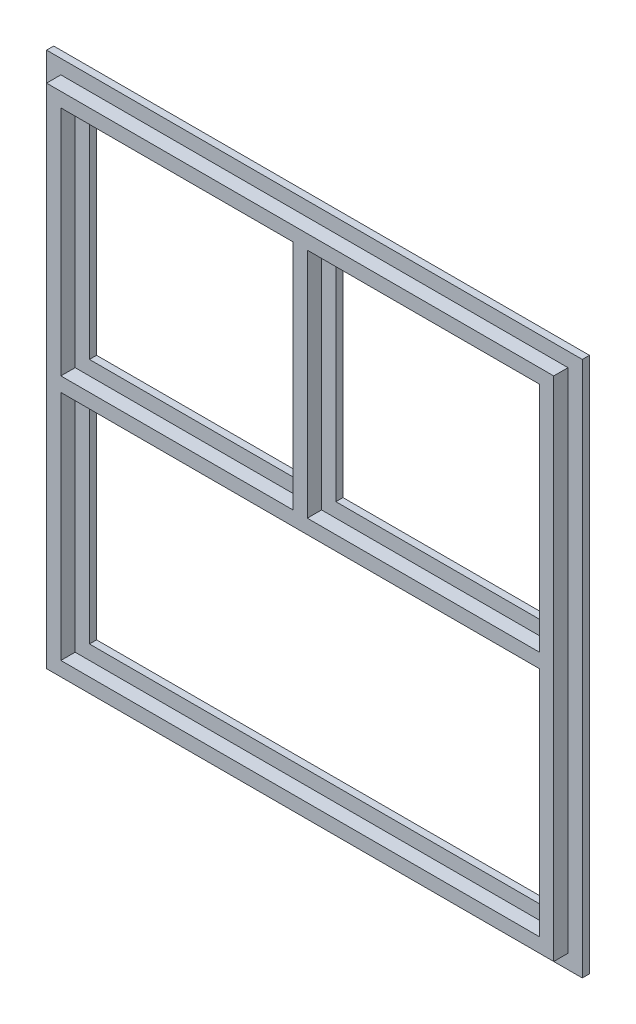
ISO-10303-21;
HEADER;
FILE_DESCRIPTION(('STEP AP214'),'2;1');
FILE_NAME('part.step','',(''),(''),'','','');
FILE_SCHEMA(('AUTOMOTIVE_DESIGN { 1 0 10303 214 1 1 1 1 }'));
ENDSEC;
DATA;
#1=APPLICATION_CONTEXT('core data for automotive mechanical design processes');
#2=APPLICATION_PROTOCOL_DEFINITION('international standard','automotive_design',2000,#1);
#3=PRODUCT_CONTEXT('',#1,'mechanical');
#4=PRODUCT('Part','Part','',(#3));
#5=PRODUCT_RELATED_PRODUCT_CATEGORY('part','',(#4));
#6=PRODUCT_DEFINITION_FORMATION('','',#4);
#7=PRODUCT_DEFINITION_CONTEXT('part definition',#1,'design');
#8=PRODUCT_DEFINITION('design','',#6,#7);
#9=PRODUCT_DEFINITION_SHAPE('','',#8);
#10=(LENGTH_UNIT() NAMED_UNIT(*) SI_UNIT(.MILLI.,.METRE.));
#11=(NAMED_UNIT(*) PLANE_ANGLE_UNIT() SI_UNIT($,.RADIAN.));
#12=(NAMED_UNIT(*) SI_UNIT($,.STERADIAN.) SOLID_ANGLE_UNIT());
#13=UNCERTAINTY_MEASURE_WITH_UNIT(LENGTH_MEASURE(1.E-05),#10,'distance_accuracy_value','');
#14=(GEOMETRIC_REPRESENTATION_CONTEXT(3) GLOBAL_UNCERTAINTY_ASSIGNED_CONTEXT((#13)) GLOBAL_UNIT_ASSIGNED_CONTEXT((#10,
#11,#12)) REPRESENTATION_CONTEXT('',''));
#15=CARTESIAN_POINT('',(0.,0.,0.));
#16=DIRECTION('',(0.,0.,1.));
#17=DIRECTION('',(1.,0.,0.));
#18=AXIS2_PLACEMENT_3D('',#15,#16,#17);
#19=CARTESIAN_POINT('',(0.,0.,1.));
#20=DIRECTION('',(0.,0.,-1.));
#21=DIRECTION('',(-1.,0.,0.));
#22=AXIS2_PLACEMENT_3D('',#19,#20,#21);
#23=PLANE('',#22);
#24=DIRECTION('',(0.,-1.,0.));
#25=VECTOR('',#24,1.);
#26=CARTESIAN_POINT('',(31.5,0.,1.));
#27=LINE('',#26,#25);
#28=CARTESIAN_POINT('',(31.5,-2.99999999999998,1.));
#29=VERTEX_POINT('',#28);
#30=CARTESIAN_POINT('',(31.5,-31.5,1.));
#31=VERTEX_POINT('',#30);
#32=EDGE_CURVE('E339',#29,#31,#27,.T.);
#33=ORIENTED_EDGE('',*,*,#32,.T.);
#34=DIRECTION('',(1.,0.,0.));
#35=VECTOR('',#34,1.);
#36=CARTESIAN_POINT('',(0.,-31.5,1.));
#37=LINE('',#36,#35);
#38=CARTESIAN_POINT('',(-31.5,-31.5,1.));
#39=VERTEX_POINT('',#38);
#40=EDGE_CURVE('E352',#39,#31,#37,.T.);
#41=ORIENTED_EDGE('',*,*,#40,.F.);
#42=DIRECTION('',(0.,-1.,0.));
#43=VECTOR('',#42,1.);
#44=CARTESIAN_POINT('',(-31.5,0.,1.));
#45=LINE('',#44,#43);
#46=CARTESIAN_POINT('',(-31.5,-2.99999999999999,1.));
#47=VERTEX_POINT('',#46);
#48=EDGE_CURVE('E348',#47,#39,#45,.T.);
#49=ORIENTED_EDGE('',*,*,#48,.F.);
#50=DIRECTION('',(1.,0.,0.));
#51=VECTOR('',#50,1.);
#52=CARTESIAN_POINT('',(0.,-2.99999999999998,1.));
#53=LINE('',#52,#51);
#54=EDGE_CURVE('E343',#47,#29,#53,.T.);
#55=ORIENTED_EDGE('',*,*,#54,.T.);
#56=EDGE_LOOP('',(#33,#41,#49,#55));
#57=FACE_BOUND('',#56,.T.);
#58=DIRECTION('',(1.,0.,0.));
#59=VECTOR('',#58,1.);
#60=CARTESIAN_POINT('',(0.,-1.,1.));
#61=LINE('',#60,#59);
#62=CARTESIAN_POINT('',(-33.5,-1.,1.));
#63=VERTEX_POINT('',#62);
#64=CARTESIAN_POINT('',(33.5,-1.,1.));
#65=VERTEX_POINT('',#64);
#66=EDGE_CURVE('E306',#63,#65,#61,.T.);
#67=ORIENTED_EDGE('',*,*,#66,.F.);
#68=DIRECTION('',(0.,-1.,0.));
#69=VECTOR('',#68,1.);
#70=CARTESIAN_POINT('',(-33.5,-33.5,1.));
#71=LINE('',#70,#69);
#72=CARTESIAN_POINT('',(-33.5,-33.5,1.));
#73=VERTEX_POINT('',#72);
#74=EDGE_CURVE('E277',#63,#73,#71,.T.);
#75=ORIENTED_EDGE('',*,*,#74,.T.);
#76=DIRECTION('',(1.,0.,0.));
#77=VECTOR('',#76,1.);
#78=CARTESIAN_POINT('',(-33.5,-33.5,1.));
#79=LINE('',#78,#77);
#80=CARTESIAN_POINT('',(33.5,-33.5,1.));
#81=VERTEX_POINT('',#80);
#82=EDGE_CURVE('E478',#73,#81,#79,.T.);
#83=ORIENTED_EDGE('',*,*,#82,.T.);
#84=DIRECTION('',(0.,1.,0.));
#85=VECTOR('',#84,1.);
#86=CARTESIAN_POINT('',(33.5,-33.5,1.));
#87=LINE('',#86,#85);
#88=EDGE_CURVE('E467',#81,#65,#87,.T.);
#89=ORIENTED_EDGE('',*,*,#88,.T.);
#90=EDGE_LOOP('',(#67,#75,#83,#89));
#91=FACE_BOUND('',#90,.T.);
#92=ADVANCED_FACE('F47',(#57,#91),#23,.F.);
#93=DIRECTION('',(1.,0.,0.));
#94=VECTOR('',#93,1.);
#95=CARTESIAN_POINT('',(2.99999999999999,31.5,1.));
#96=LINE('',#95,#94);
#97=CARTESIAN_POINT('',(2.99999999999999,31.5,1.));
#98=VERTEX_POINT('',#97);
#99=CARTESIAN_POINT('',(31.5,31.5,1.));
#100=VERTEX_POINT('',#99);
#101=EDGE_CURVE('E384',#98,#100,#96,.T.);
#102=ORIENTED_EDGE('',*,*,#101,.T.);
#103=DIRECTION('',(0.,1.,0.));
#104=VECTOR('',#103,1.);
#105=CARTESIAN_POINT('',(31.5,3.00000000000001,1.));
#106=LINE('',#105,#104);
#107=CARTESIAN_POINT('',(31.5,3.00000000000001,1.));
#108=VERTEX_POINT('',#107);
#109=EDGE_CURVE('E419',#108,#100,#106,.T.);
#110=ORIENTED_EDGE('',*,*,#109,.F.);
#111=DIRECTION('',(1.,0.,0.));
#112=VECTOR('',#111,1.);
#113=CARTESIAN_POINT('',(2.99999999999999,3.00000000000001,1.));
#114=LINE('',#113,#112);
#115=CARTESIAN_POINT('',(2.99999999999999,3.00000000000001,1.));
#116=VERTEX_POINT('',#115);
#117=EDGE_CURVE('E415',#116,#108,#114,.T.);
#118=ORIENTED_EDGE('',*,*,#117,.F.);
#119=DIRECTION('',(0.,1.,0.));
#120=VECTOR('',#119,1.);
#121=CARTESIAN_POINT('',(2.99999999999999,3.00000000000001,1.));
#122=LINE('',#121,#120);
#123=EDGE_CURVE('E411',#116,#98,#122,.T.);
#124=ORIENTED_EDGE('',*,*,#123,.T.);
#125=EDGE_LOOP('',(#102,#110,#118,#124));
#126=FACE_BOUND('',#125,.T.);
#127=DIRECTION('',(-1.,0.,0.));
#128=VECTOR('',#127,1.);
#129=CARTESIAN_POINT('',(0.,1.00000000000001,1.));
#130=LINE('',#129,#128);
#131=CARTESIAN_POINT('',(33.5,1.00000000000001,1.));
#132=VERTEX_POINT('',#131);
#133=CARTESIAN_POINT('',(1.,1.00000000000001,1.));
#134=VERTEX_POINT('',#133);
#135=EDGE_CURVE('E309',#132,#134,#130,.T.);
#136=ORIENTED_EDGE('',*,*,#135,.F.);
#137=CARTESIAN_POINT('',(33.5,33.5,1.));
#138=VERTEX_POINT('',#137);
#139=EDGE_CURVE('E455',#132,#138,#87,.T.);
#140=ORIENTED_EDGE('',*,*,#139,.T.);
#141=DIRECTION('',(-1.,0.,0.));
#142=VECTOR('',#141,1.);
#143=CARTESIAN_POINT('',(-33.5,33.5,1.));
#144=LINE('',#143,#142);
#145=CARTESIAN_POINT('',(1.,33.5,1.));
#146=VERTEX_POINT('',#145);
#147=EDGE_CURVE('E472',#138,#146,#144,.T.);
#148=ORIENTED_EDGE('',*,*,#147,.T.);
#149=DIRECTION('',(0.,1.,0.));
#150=VECTOR('',#149,1.);
#151=CARTESIAN_POINT('',(1.,0.,1.));
#152=LINE('',#151,#150);
#153=EDGE_CURVE('E63',#134,#146,#152,.T.);
#154=ORIENTED_EDGE('',*,*,#153,.F.);
#155=EDGE_LOOP('',(#136,#140,#148,#154));
#156=FACE_BOUND('',#155,.T.);
#157=ADVANCED_FACE('F614',(#126,#156),#23,.F.);
#158=DIRECTION('',(-1.,0.,0.));
#159=VECTOR('',#158,1.);
#160=CARTESIAN_POINT('',(-3.00000000000001,31.5,1.));
#161=LINE('',#160,#159);
#162=CARTESIAN_POINT('',(-3.00000000000001,31.5,1.));
#163=VERTEX_POINT('',#162);
#164=CARTESIAN_POINT('',(-31.5,31.5,1.));
#165=VERTEX_POINT('',#164);
#166=EDGE_CURVE('E344',#163,#165,#161,.T.);
#167=ORIENTED_EDGE('',*,*,#166,.F.);
#168=DIRECTION('',(0.,1.,0.));
#169=VECTOR('',#168,1.);
#170=CARTESIAN_POINT('',(-3.00000000000002,3.00000000000001,1.));
#171=LINE('',#170,#169);
#172=CARTESIAN_POINT('',(-3.00000000000002,3.00000000000001,1.));
#173=VERTEX_POINT('',#172);
#174=EDGE_CURVE('E373',#173,#163,#171,.T.);
#175=ORIENTED_EDGE('',*,*,#174,.F.);
#176=DIRECTION('',(-1.,0.,0.));
#177=VECTOR('',#176,1.);
#178=CARTESIAN_POINT('',(-3.00000000000002,3.00000000000001,1.));
#179=LINE('',#178,#177);
#180=CARTESIAN_POINT('',(-31.5,3.00000000000001,1.));
#181=VERTEX_POINT('',#180);
#182=EDGE_CURVE('E388',#173,#181,#179,.T.);
#183=ORIENTED_EDGE('',*,*,#182,.T.);
#184=DIRECTION('',(0.,1.,0.));
#185=VECTOR('',#184,1.);
#186=CARTESIAN_POINT('',(-31.5,3.00000000000001,1.));
#187=LINE('',#186,#185);
#188=EDGE_CURVE('E392',#181,#165,#187,.T.);
#189=ORIENTED_EDGE('',*,*,#188,.T.);
#190=EDGE_LOOP('',(#167,#175,#183,#189));
#191=FACE_BOUND('',#190,.T.);
#192=DIRECTION('',(0.,-1.,0.));
#193=VECTOR('',#192,1.);
#194=CARTESIAN_POINT('',(-1.,0.,1.));
#195=LINE('',#194,#193);
#196=CARTESIAN_POINT('',(-1.,33.5,1.));
#197=VERTEX_POINT('',#196);
#198=CARTESIAN_POINT('',(-1.,1.00000000000001,1.));
#199=VERTEX_POINT('',#198);
#200=EDGE_CURVE('E292',#197,#199,#195,.T.);
#201=ORIENTED_EDGE('',*,*,#200,.F.);
#202=CARTESIAN_POINT('',(-33.5,33.5,1.));
#203=VERTEX_POINT('',#202);
#204=EDGE_CURVE('E471',#197,#203,#144,.T.);
#205=ORIENTED_EDGE('',*,*,#204,.T.);
#206=CARTESIAN_POINT('',(-33.5,1.,1.));
#207=VERTEX_POINT('',#206);
#208=EDGE_CURVE('E475',#203,#207,#71,.T.);
#209=ORIENTED_EDGE('',*,*,#208,.T.);
#210=DIRECTION('',(-1.,0.,0.));
#211=VECTOR('',#210,1.);
#212=CARTESIAN_POINT('',(0.,1.00000000000001,1.));
#213=LINE('',#212,#211);
#214=EDGE_CURVE('E71',#199,#207,#213,.T.);
#215=ORIENTED_EDGE('',*,*,#214,.F.);
#216=EDGE_LOOP('',(#201,#205,#209,#215));
#217=FACE_BOUND('',#216,.T.);
#218=ADVANCED_FACE('F611',(#191,#217),#23,.F.);
#219=CARTESIAN_POINT('',(33.5,-33.5,3.));
#220=DIRECTION('',(-1.,0.,0.));
#221=DIRECTION('',(0.,0.,1.));
#222=AXIS2_PLACEMENT_3D('',#219,#220,#221);
#223=PLANE('',#222);
#224=DIRECTION('',(0.,1.,0.));
#225=VECTOR('',#224,1.);
#226=CARTESIAN_POINT('',(33.5,-33.5,3.));
#227=LINE('',#226,#225);
#228=CARTESIAN_POINT('',(33.5,-33.5,3.));
#229=VERTEX_POINT('',#228);
#230=CARTESIAN_POINT('',(33.5,-1.,3.));
#231=VERTEX_POINT('',#230);
#232=EDGE_CURVE('E456',#229,#231,#227,.T.);
#233=ORIENTED_EDGE('',*,*,#232,.T.);
#234=DIRECTION('',(0.,0.,-1.));
#235=VECTOR('',#234,1.);
#236=CARTESIAN_POINT('',(33.5,-1.,3.));
#237=LINE('',#236,#235);
#238=EDGE_CURVE('E282',#231,#65,#237,.T.);
#239=ORIENTED_EDGE('',*,*,#238,.T.);
#240=ORIENTED_EDGE('',*,*,#88,.F.);
#241=DIRECTION('',(0.,0.,-1.));
#242=VECTOR('',#241,1.);
#243=CARTESIAN_POINT('',(33.5,-33.5,3.));
#244=LINE('',#243,#242);
#245=EDGE_CURVE('E466',#229,#81,#244,.T.);
#246=ORIENTED_EDGE('',*,*,#245,.F.);
#247=EDGE_LOOP('',(#233,#239,#240,#246));
#248=FACE_BOUND('',#247,.T.);
#249=ADVANCED_FACE('F613',(#248),#223,.T.);
#250=ORIENTED_EDGE('',*,*,#139,.F.);
#251=DIRECTION('',(0.,0.,-1.));
#252=VECTOR('',#251,1.);
#253=CARTESIAN_POINT('',(33.5,1.00000000000001,3.));
#254=LINE('',#253,#252);
#255=CARTESIAN_POINT('',(33.5,1.00000000000001,3.));
#256=VERTEX_POINT('',#255);
#257=EDGE_CURVE('E333',#256,#132,#254,.T.);
#258=ORIENTED_EDGE('',*,*,#257,.F.);
#259=CARTESIAN_POINT('',(33.5,33.5,3.));
#260=VERTEX_POINT('',#259);
#261=EDGE_CURVE('E460',#256,#260,#227,.T.);
#262=ORIENTED_EDGE('',*,*,#261,.T.);
#263=DIRECTION('',(0.,0.,-1.));
#264=VECTOR('',#263,1.);
#265=CARTESIAN_POINT('',(33.5,33.5,3.));
#266=LINE('',#265,#264);
#267=EDGE_CURVE('E491',#260,#138,#266,.T.);
#268=ORIENTED_EDGE('',*,*,#267,.T.);
#269=EDGE_LOOP('',(#250,#258,#262,#268));
#270=FACE_BOUND('',#269,.T.);
#271=ADVANCED_FACE('F645',(#270),#223,.T.);
#272=CARTESIAN_POINT('',(-33.5,33.5,3.));
#273=DIRECTION('',(0.,-1.,0.));
#274=DIRECTION('',(0.,0.,-1.));
#275=AXIS2_PLACEMENT_3D('',#272,#273,#274);
#276=PLANE('',#275);
#277=DIRECTION('',(-1.,0.,0.));
#278=VECTOR('',#277,1.);
#279=CARTESIAN_POINT('',(-33.5,33.5,3.));
#280=LINE('',#279,#278);
#281=CARTESIAN_POINT('',(1.,33.5,3.));
#282=VERTEX_POINT('',#281);
#283=EDGE_CURVE('E271',#260,#282,#280,.T.);
#284=ORIENTED_EDGE('',*,*,#283,.T.);
#285=DIRECTION('',(0.,0.,-1.));
#286=VECTOR('',#285,1.);
#287=CARTESIAN_POINT('',(1.,33.5,3.));
#288=LINE('',#287,#286);
#289=EDGE_CURVE('E326',#282,#146,#288,.T.);
#290=ORIENTED_EDGE('',*,*,#289,.T.);
#291=ORIENTED_EDGE('',*,*,#147,.F.);
#292=ORIENTED_EDGE('',*,*,#267,.F.);
#293=EDGE_LOOP('',(#284,#290,#291,#292));
#294=FACE_BOUND('',#293,.T.);
#295=ADVANCED_FACE('F642',(#294),#276,.T.);
#296=ORIENTED_EDGE('',*,*,#204,.F.);
#297=DIRECTION('',(0.,0.,-1.));
#298=VECTOR('',#297,1.);
#299=CARTESIAN_POINT('',(-1.,33.5,3.));
#300=LINE('',#299,#298);
#301=CARTESIAN_POINT('',(-1.,33.5,3.));
#302=VERTEX_POINT('',#301);
#303=EDGE_CURVE('E322',#302,#197,#300,.T.);
#304=ORIENTED_EDGE('',*,*,#303,.F.);
#305=CARTESIAN_POINT('',(-33.5,33.5,3.));
#306=VERTEX_POINT('',#305);
#307=EDGE_CURVE('E459',#302,#306,#280,.T.);
#308=ORIENTED_EDGE('',*,*,#307,.T.);
#309=DIRECTION('',(0.,0.,-1.));
#310=VECTOR('',#309,1.);
#311=CARTESIAN_POINT('',(-33.5,33.5,3.));
#312=LINE('',#311,#310);
#313=EDGE_CURVE('E487',#306,#203,#312,.T.);
#314=ORIENTED_EDGE('',*,*,#313,.T.);
#315=EDGE_LOOP('',(#296,#304,#308,#314));
#316=FACE_BOUND('',#315,.T.);
#317=ADVANCED_FACE('F621',(#316),#276,.T.);
#318=CARTESIAN_POINT('',(-33.5,-33.5,3.));
#319=DIRECTION('',(1.,0.,0.));
#320=DIRECTION('',(0.,0.,-1.));
#321=AXIS2_PLACEMENT_3D('',#318,#319,#320);
#322=PLANE('',#321);
#323=ORIENTED_EDGE('',*,*,#74,.F.);
#324=DIRECTION('',(0.,0.,-1.));
#325=VECTOR('',#324,1.);
#326=CARTESIAN_POINT('',(-33.5,-1.,3.));
#327=LINE('',#326,#325);
#328=CARTESIAN_POINT('',(-33.5,-1.,3.));
#329=VERTEX_POINT('',#328);
#330=EDGE_CURVE('E275',#329,#63,#327,.T.);
#331=ORIENTED_EDGE('',*,*,#330,.F.);
#332=DIRECTION('',(0.,-1.,0.));
#333=VECTOR('',#332,1.);
#334=CARTESIAN_POINT('',(-33.5,-33.5,3.));
#335=LINE('',#334,#333);
#336=CARTESIAN_POINT('',(-33.5,-33.5,3.));
#337=VERTEX_POINT('',#336);
#338=EDGE_CURVE('E258',#329,#337,#335,.T.);
#339=ORIENTED_EDGE('',*,*,#338,.T.);
#340=DIRECTION('',(0.,0.,-1.));
#341=VECTOR('',#340,1.);
#342=CARTESIAN_POINT('',(-33.5,-33.5,3.));
#343=LINE('',#342,#341);
#344=EDGE_CURVE('E484',#337,#73,#343,.T.);
#345=ORIENTED_EDGE('',*,*,#344,.T.);
#346=EDGE_LOOP('',(#323,#331,#339,#345));
#347=FACE_BOUND('',#346,.T.);
#348=ADVANCED_FACE('F276',(#347),#322,.T.);
#349=CARTESIAN_POINT('',(-33.5,1.,3.));
#350=VERTEX_POINT('',#349);
#351=EDGE_CURVE('E270',#306,#350,#335,.T.);
#352=ORIENTED_EDGE('',*,*,#351,.T.);
#353=DIRECTION('',(0.,0.,-1.));
#354=VECTOR('',#353,1.);
#355=CARTESIAN_POINT('',(-33.5,1.,3.));
#356=LINE('',#355,#354);
#357=EDGE_CURVE('E305',#350,#207,#356,.T.);
#358=ORIENTED_EDGE('',*,*,#357,.T.);
#359=ORIENTED_EDGE('',*,*,#208,.F.);
#360=ORIENTED_EDGE('',*,*,#313,.F.);
#361=EDGE_LOOP('',(#352,#358,#359,#360));
#362=FACE_BOUND('',#361,.T.);
#363=ADVANCED_FACE('F684',(#362),#322,.T.);
#364=CARTESIAN_POINT('',(0.,0.,0.));
#365=DIRECTION('',(0.,0.,-1.));
#366=DIRECTION('',(-1.,0.,0.));
#367=AXIS2_PLACEMENT_3D('',#364,#365,#366);
#368=PLANE('',#367);
#369=DIRECTION('',(1.,0.,0.));
#370=VECTOR('',#369,1.);
#371=CARTESIAN_POINT('',(0.,31.5,0.));
#372=LINE('',#371,#370);
#373=CARTESIAN_POINT('',(-31.5,31.5,0.));
#374=VERTEX_POINT('',#373);
#375=CARTESIAN_POINT('',(-3.00000000000001,31.5,0.));
#376=VERTEX_POINT('',#375);
#377=EDGE_CURVE('E11',#374,#376,#372,.T.);
#378=ORIENTED_EDGE('',*,*,#377,.F.);
#379=DIRECTION('',(0.,-1.,0.));
#380=VECTOR('',#379,1.);
#381=CARTESIAN_POINT('',(-31.5,0.,0.));
#382=LINE('',#381,#380);
#383=CARTESIAN_POINT('',(-31.5,3.00000000000001,0.));
#384=VERTEX_POINT('',#383);
#385=EDGE_CURVE('E582',#374,#384,#382,.T.);
#386=ORIENTED_EDGE('',*,*,#385,.T.);
#387=DIRECTION('',(1.,0.,0.));
#388=VECTOR('',#387,1.);
#389=CARTESIAN_POINT('',(0.,3.00000000000001,0.));
#390=LINE('',#389,#388);
#391=CARTESIAN_POINT('',(-3.00000000000002,3.00000000000001,0.));
#392=VERTEX_POINT('',#391);
#393=EDGE_CURVE('E586',#384,#392,#390,.T.);
#394=ORIENTED_EDGE('',*,*,#393,.T.);
#395=DIRECTION('',(0.,-1.,0.));
#396=VECTOR('',#395,1.);
#397=CARTESIAN_POINT('',(-3.00000000000002,0.,0.));
#398=LINE('',#397,#396);
#399=EDGE_CURVE('E56',#376,#392,#398,.T.);
#400=ORIENTED_EDGE('',*,*,#399,.F.);
#401=EDGE_LOOP('',(#378,#386,#394,#400));
#402=FACE_BOUND('',#401,.T.);
#403=DIRECTION('',(0.,1.,0.));
#404=VECTOR('',#403,1.);
#405=CARTESIAN_POINT('',(37.5,-37.5,0.));
#406=LINE('',#405,#404);
#407=CARTESIAN_POINT('',(37.5,-37.5,0.));
#408=VERTEX_POINT('',#407);
#409=CARTESIAN_POINT('',(37.5,37.5,0.));
#410=VERTEX_POINT('',#409);
#411=EDGE_CURVE('E540',#408,#410,#406,.T.);
#412=ORIENTED_EDGE('',*,*,#411,.F.);
#413=DIRECTION('',(1.,0.,0.));
#414=VECTOR('',#413,1.);
#415=CARTESIAN_POINT('',(-37.5,-37.5,0.));
#416=LINE('',#415,#414);
#417=CARTESIAN_POINT('',(-37.5,-37.5,0.));
#418=VERTEX_POINT('',#417);
#419=EDGE_CURVE('E546',#418,#408,#416,.T.);
#420=ORIENTED_EDGE('',*,*,#419,.F.);
#421=DIRECTION('',(0.,-1.,0.));
#422=VECTOR('',#421,1.);
#423=CARTESIAN_POINT('',(-37.5,-37.5,0.));
#424=LINE('',#423,#422);
#425=CARTESIAN_POINT('',(-37.5,37.5,0.));
#426=VERTEX_POINT('',#425);
#427=EDGE_CURVE('E562',#426,#418,#424,.T.);
#428=ORIENTED_EDGE('',*,*,#427,.F.);
#429=DIRECTION('',(-1.,0.,0.));
#430=VECTOR('',#429,1.);
#431=CARTESIAN_POINT('',(-37.5,37.5,0.));
#432=LINE('',#431,#430);
#433=EDGE_CURVE('E559',#410,#426,#432,.T.);
#434=ORIENTED_EDGE('',*,*,#433,.F.);
#435=EDGE_LOOP('',(#412,#420,#428,#434));
#436=FACE_BOUND('',#435,.T.);
#437=DIRECTION('',(0.,-1.,0.));
#438=VECTOR('',#437,1.);
#439=CARTESIAN_POINT('',(31.5,0.,0.));
#440=LINE('',#439,#438);
#441=CARTESIAN_POINT('',(31.5,31.5,0.));
#442=VERTEX_POINT('',#441);
#443=CARTESIAN_POINT('',(31.5,3.00000000000001,0.));
#444=VERTEX_POINT('',#443);
#445=EDGE_CURVE('E433',#442,#444,#440,.T.);
#446=ORIENTED_EDGE('',*,*,#445,.F.);
#447=DIRECTION('',(-1.,0.,0.));
#448=VECTOR('',#447,1.);
#449=CARTESIAN_POINT('',(0.,31.5,0.));
#450=LINE('',#449,#448);
#451=CARTESIAN_POINT('',(2.99999999999999,31.5,0.));
#452=VERTEX_POINT('',#451);
#453=EDGE_CURVE('E436',#442,#452,#450,.T.);
#454=ORIENTED_EDGE('',*,*,#453,.T.);
#455=DIRECTION('',(0.,-1.,0.));
#456=VECTOR('',#455,1.);
#457=CARTESIAN_POINT('',(2.99999999999999,0.,0.));
#458=LINE('',#457,#456);
#459=CARTESIAN_POINT('',(2.99999999999999,3.00000000000001,0.));
#460=VERTEX_POINT('',#459);
#461=EDGE_CURVE('E360',#452,#460,#458,.T.);
#462=ORIENTED_EDGE('',*,*,#461,.T.);
#463=DIRECTION('',(-1.,0.,0.));
#464=VECTOR('',#463,1.);
#465=CARTESIAN_POINT('',(0.,3.00000000000001,0.));
#466=LINE('',#465,#464);
#467=EDGE_CURVE('E429',#444,#460,#466,.T.);
#468=ORIENTED_EDGE('',*,*,#467,.F.);
#469=EDGE_LOOP('',(#446,#454,#462,#468));
#470=FACE_BOUND('',#469,.T.);
#471=DIRECTION('',(-1.,0.,0.));
#472=VECTOR('',#471,1.);
#473=CARTESIAN_POINT('',(0.,-31.5,0.));
#474=LINE('',#473,#472);
#475=CARTESIAN_POINT('',(31.5,-31.5,0.));
#476=VERTEX_POINT('',#475);
#477=CARTESIAN_POINT('',(-31.5,-31.5,0.));
#478=VERTEX_POINT('',#477);
#479=EDGE_CURVE('E448',#476,#478,#474,.T.);
#480=ORIENTED_EDGE('',*,*,#479,.F.);
#481=DIRECTION('',(0.,1.,0.));
#482=VECTOR('',#481,1.);
#483=CARTESIAN_POINT('',(31.5,0.,0.));
#484=LINE('',#483,#482);
#485=CARTESIAN_POINT('',(31.5,-2.99999999999998,0.));
#486=VERTEX_POINT('',#485);
#487=EDGE_CURVE('E451',#476,#486,#484,.T.);
#488=ORIENTED_EDGE('',*,*,#487,.T.);
#489=DIRECTION('',(-1.,0.,0.));
#490=VECTOR('',#489,1.);
#491=CARTESIAN_POINT('',(0.,-2.99999999999998,0.));
#492=LINE('',#491,#490);
#493=CARTESIAN_POINT('',(-31.5,-2.99999999999998,0.));
#494=VERTEX_POINT('',#493);
#495=EDGE_CURVE('E440',#486,#494,#492,.T.);
#496=ORIENTED_EDGE('',*,*,#495,.T.);
#497=DIRECTION('',(0.,1.,0.));
#498=VECTOR('',#497,1.);
#499=CARTESIAN_POINT('',(-31.5,0.,0.));
#500=LINE('',#499,#498);
#501=EDGE_CURVE('E444',#478,#494,#500,.T.);
#502=ORIENTED_EDGE('',*,*,#501,.F.);
#503=EDGE_LOOP('',(#480,#488,#496,#502));
#504=FACE_BOUND('',#503,.T.);
#505=ADVANCED_FACE('F601',(#402,#436,#470,#504),#368,.T.);
#506=DIRECTION('',(0.,1.,0.));
#507=VECTOR('',#506,1.);
#508=CARTESIAN_POINT('',(37.5,-37.5,1.));
#509=LINE('',#508,#507);
#510=CARTESIAN_POINT('',(37.5,-37.5,1.));
#511=VERTEX_POINT('',#510);
#512=CARTESIAN_POINT('',(37.5,37.5,1.));
#513=VERTEX_POINT('',#512);
#514=EDGE_CURVE('E541',#511,#513,#509,.T.);
#515=ORIENTED_EDGE('',*,*,#514,.T.);
#516=DIRECTION('',(-1.,0.,0.));
#517=VECTOR('',#516,1.);
#518=CARTESIAN_POINT('',(-37.5,37.5,1.));
#519=LINE('',#518,#517);
#520=CARTESIAN_POINT('',(-37.5,37.5,1.));
#521=VERTEX_POINT('',#520);
#522=EDGE_CURVE('E545',#513,#521,#519,.T.);
#523=ORIENTED_EDGE('',*,*,#522,.T.);
#524=DIRECTION('',(0.,-1.,0.));
#525=VECTOR('',#524,1.);
#526=CARTESIAN_POINT('',(-37.5,-37.5,1.));
#527=LINE('',#526,#525);
#528=CARTESIAN_POINT('',(-37.5,-37.5,1.));
#529=VERTEX_POINT('',#528);
#530=EDGE_CURVE('E549',#521,#529,#527,.T.);
#531=ORIENTED_EDGE('',*,*,#530,.T.);
#532=DIRECTION('',(1.,0.,0.));
#533=VECTOR('',#532,1.);
#534=CARTESIAN_POINT('',(-37.5,-37.5,1.));
#535=LINE('',#534,#533);
#536=EDGE_CURVE('E552',#529,#511,#535,.T.);
#537=ORIENTED_EDGE('',*,*,#536,.T.);
#538=EDGE_LOOP('',(#515,#523,#531,#537));
#539=FACE_BOUND('',#538,.T.);
#540=DIRECTION('',(0.,1.,0.));
#541=VECTOR('',#540,1.);
#542=CARTESIAN_POINT('',(35.5,-35.5,1.));
#543=LINE('',#542,#541);
#544=CARTESIAN_POINT('',(35.5,-35.5,1.));
#545=VERTEX_POINT('',#544);
#546=CARTESIAN_POINT('',(35.5,35.5,1.));
#547=VERTEX_POINT('',#546);
#548=EDGE_CURVE('E495',#545,#547,#543,.T.);
#549=ORIENTED_EDGE('',*,*,#548,.F.);
#550=DIRECTION('',(1.,0.,0.));
#551=VECTOR('',#550,1.);
#552=CARTESIAN_POINT('',(-35.5,-35.5,1.));
#553=LINE('',#552,#551);
#554=CARTESIAN_POINT('',(-35.5,-35.5,1.));
#555=VERTEX_POINT('',#554);
#556=EDGE_CURVE('E501',#555,#545,#553,.T.);
#557=ORIENTED_EDGE('',*,*,#556,.F.);
#558=DIRECTION('',(0.,-1.,0.));
#559=VECTOR('',#558,1.);
#560=CARTESIAN_POINT('',(-35.5,-35.5,1.));
#561=LINE('',#560,#559);
#562=CARTESIAN_POINT('',(-35.5,35.5,1.));
#563=VERTEX_POINT('',#562);
#564=EDGE_CURVE('E518',#563,#555,#561,.T.);
#565=ORIENTED_EDGE('',*,*,#564,.F.);
#566=DIRECTION('',(-1.,0.,0.));
#567=VECTOR('',#566,1.);
#568=CARTESIAN_POINT('',(-35.5,35.5,1.));
#569=LINE('',#568,#567);
#570=EDGE_CURVE('E514',#547,#563,#569,.T.);
#571=ORIENTED_EDGE('',*,*,#570,.F.);
#572=EDGE_LOOP('',(#549,#557,#565,#571));
#573=FACE_BOUND('',#572,.T.);
#574=ADVANCED_FACE('F616',(#539,#573),#23,.F.);
#575=CARTESIAN_POINT('',(37.5,-37.5,1.));
#576=DIRECTION('',(-1.,0.,0.));
#577=DIRECTION('',(0.,0.,1.));
#578=AXIS2_PLACEMENT_3D('',#575,#576,#577);
#579=PLANE('',#578);
#580=ORIENTED_EDGE('',*,*,#411,.T.);
#581=DIRECTION('',(0.,0.,-1.));
#582=VECTOR('',#581,1.);
#583=CARTESIAN_POINT('',(37.5,37.5,1.));
#584=LINE('',#583,#582);
#585=EDGE_CURVE('E578',#513,#410,#584,.T.);
#586=ORIENTED_EDGE('',*,*,#585,.F.);
#587=ORIENTED_EDGE('',*,*,#514,.F.);
#588=DIRECTION('',(0.,0.,-1.));
#589=VECTOR('',#588,1.);
#590=CARTESIAN_POINT('',(37.5,-37.5,1.));
#591=LINE('',#590,#589);
#592=EDGE_CURVE('E555',#511,#408,#591,.T.);
#593=ORIENTED_EDGE('',*,*,#592,.T.);
#594=EDGE_LOOP('',(#580,#586,#587,#593));
#595=FACE_BOUND('',#594,.T.);
#596=ADVANCED_FACE('F49',(#595),#579,.F.);
#597=CARTESIAN_POINT('',(-37.5,37.5,1.));
#598=DIRECTION('',(0.,-1.,0.));
#599=DIRECTION('',(0.,0.,-1.));
#600=AXIS2_PLACEMENT_3D('',#597,#598,#599);
#601=PLANE('',#600);
#602=ORIENTED_EDGE('',*,*,#433,.T.);
#603=DIRECTION('',(0.,0.,-1.));
#604=VECTOR('',#603,1.);
#605=CARTESIAN_POINT('',(-37.5,37.5,1.));
#606=LINE('',#605,#604);
#607=EDGE_CURVE('E574',#521,#426,#606,.T.);
#608=ORIENTED_EDGE('',*,*,#607,.F.);
#609=ORIENTED_EDGE('',*,*,#522,.F.);
#610=ORIENTED_EDGE('',*,*,#585,.T.);
#611=EDGE_LOOP('',(#602,#608,#609,#610));
#612=FACE_BOUND('',#611,.T.);
#613=ADVANCED_FACE('F681',(#612),#601,.F.);
#614=CARTESIAN_POINT('',(-37.5,-37.5,1.));
#615=DIRECTION('',(1.,0.,0.));
#616=DIRECTION('',(0.,0.,-1.));
#617=AXIS2_PLACEMENT_3D('',#614,#615,#616);
#618=PLANE('',#617);
#619=ORIENTED_EDGE('',*,*,#427,.T.);
#620=DIRECTION('',(0.,0.,-1.));
#621=VECTOR('',#620,1.);
#622=CARTESIAN_POINT('',(-37.5,-37.5,1.));
#623=LINE('',#622,#621);
#624=EDGE_CURVE('E570',#529,#418,#623,.T.);
#625=ORIENTED_EDGE('',*,*,#624,.F.);
#626=ORIENTED_EDGE('',*,*,#530,.F.);
#627=ORIENTED_EDGE('',*,*,#607,.T.);
#628=EDGE_LOOP('',(#619,#625,#626,#627));
#629=FACE_BOUND('',#628,.T.);
#630=ADVANCED_FACE('F984',(#629),#618,.F.);
#631=CARTESIAN_POINT('',(-37.5,-37.5,1.));
#632=DIRECTION('',(0.,1.,0.));
#633=DIRECTION('',(0.,0.,1.));
#634=AXIS2_PLACEMENT_3D('',#631,#632,#633);
#635=PLANE('',#634);
#636=ORIENTED_EDGE('',*,*,#419,.T.);
#637=ORIENTED_EDGE('',*,*,#592,.F.);
#638=ORIENTED_EDGE('',*,*,#536,.F.);
#639=ORIENTED_EDGE('',*,*,#624,.T.);
#640=EDGE_LOOP('',(#636,#637,#638,#639));
#641=FACE_BOUND('',#640,.T.);
#642=ADVANCED_FACE('F715',(#641),#635,.F.);
#643=CARTESIAN_POINT('',(0.,0.,3.));
#644=DIRECTION('',(0.,0.,-1.));
#645=DIRECTION('',(-1.,0.,0.));
#646=AXIS2_PLACEMENT_3D('',#643,#644,#645);
#647=PLANE('',#646);
#648=ORIENTED_EDGE('',*,*,#261,.F.);
#649=DIRECTION('',(-1.,0.,0.));
#650=VECTOR('',#649,1.);
#651=CARTESIAN_POINT('',(0.,1.00000000000001,3.));
#652=LINE('',#651,#650);
#653=CARTESIAN_POINT('',(1.,1.00000000000001,3.));
#654=VERTEX_POINT('',#653);
#655=EDGE_CURVE('E286',#256,#654,#652,.T.);
#656=ORIENTED_EDGE('',*,*,#655,.T.);
#657=DIRECTION('',(0.,1.,0.));
#658=VECTOR('',#657,1.);
#659=CARTESIAN_POINT('',(1.,0.,3.));
#660=LINE('',#659,#658);
#661=EDGE_CURVE('E290',#654,#282,#660,.T.);
#662=ORIENTED_EDGE('',*,*,#661,.T.);
#663=ORIENTED_EDGE('',*,*,#283,.F.);
#664=EDGE_LOOP('',(#648,#656,#662,#663));
#665=FACE_BOUND('',#664,.T.);
#666=ORIENTED_EDGE('',*,*,#307,.F.);
#667=DIRECTION('',(0.,-1.,0.));
#668=VECTOR('',#667,1.);
#669=CARTESIAN_POINT('',(-1.,0.,3.));
#670=LINE('',#669,#668);
#671=CARTESIAN_POINT('',(-1.,1.00000000000001,3.));
#672=VERTEX_POINT('',#671);
#673=EDGE_CURVE('E298',#302,#672,#670,.T.);
#674=ORIENTED_EDGE('',*,*,#673,.T.);
#675=DIRECTION('',(-1.,0.,0.));
#676=VECTOR('',#675,1.);
#677=CARTESIAN_POINT('',(0.,1.00000000000001,3.));
#678=LINE('',#677,#676);
#679=EDGE_CURVE('E301',#672,#350,#678,.T.);
#680=ORIENTED_EDGE('',*,*,#679,.T.);
#681=ORIENTED_EDGE('',*,*,#351,.F.);
#682=EDGE_LOOP('',(#666,#674,#680,#681));
#683=FACE_BOUND('',#682,.T.);
#684=DIRECTION('',(0.,1.,0.));
#685=VECTOR('',#684,1.);
#686=CARTESIAN_POINT('',(35.5,-35.5,3.));
#687=LINE('',#686,#685);
#688=CARTESIAN_POINT('',(35.5,-35.5,3.));
#689=VERTEX_POINT('',#688);
#690=CARTESIAN_POINT('',(35.5,35.5,3.));
#691=VERTEX_POINT('',#690);
#692=EDGE_CURVE('E496',#689,#691,#687,.T.);
#693=ORIENTED_EDGE('',*,*,#692,.T.);
#694=DIRECTION('',(-1.,0.,0.));
#695=VECTOR('',#694,1.);
#696=CARTESIAN_POINT('',(-35.5,35.5,3.));
#697=LINE('',#696,#695);
#698=CARTESIAN_POINT('',(-35.5,35.5,3.));
#699=VERTEX_POINT('',#698);
#700=EDGE_CURVE('E500',#691,#699,#697,.T.);
#701=ORIENTED_EDGE('',*,*,#700,.T.);
#702=DIRECTION('',(0.,-1.,0.));
#703=VECTOR('',#702,1.);
#704=CARTESIAN_POINT('',(-35.5,-35.5,3.));
#705=LINE('',#704,#703);
#706=CARTESIAN_POINT('',(-35.5,-35.5,3.));
#707=VERTEX_POINT('',#706);
#708=EDGE_CURVE('E504',#699,#707,#705,.T.);
#709=ORIENTED_EDGE('',*,*,#708,.T.);
#710=DIRECTION('',(1.,0.,0.));
#711=VECTOR('',#710,1.);
#712=CARTESIAN_POINT('',(-35.5,-35.5,3.));
#713=LINE('',#712,#711);
#714=EDGE_CURVE('E507',#707,#689,#713,.T.);
#715=ORIENTED_EDGE('',*,*,#714,.T.);
#716=EDGE_LOOP('',(#693,#701,#709,#715));
#717=FACE_BOUND('',#716,.T.);
#718=ORIENTED_EDGE('',*,*,#232,.F.);
#719=DIRECTION('',(1.,0.,0.));
#720=VECTOR('',#719,1.);
#721=CARTESIAN_POINT('',(-33.5,-33.5,3.));
#722=LINE('',#721,#720);
#723=EDGE_CURVE('E265',#337,#229,#722,.T.);
#724=ORIENTED_EDGE('',*,*,#723,.F.);
#725=ORIENTED_EDGE('',*,*,#338,.F.);
#726=DIRECTION('',(1.,0.,0.));
#727=VECTOR('',#726,1.);
#728=CARTESIAN_POINT('',(0.,-1.,3.));
#729=LINE('',#728,#727);
#730=EDGE_CURVE('E263',#329,#231,#729,.T.);
#731=ORIENTED_EDGE('',*,*,#730,.T.);
#732=EDGE_LOOP('',(#718,#724,#725,#731));
#733=FACE_BOUND('',#732,.T.);
#734=ADVANCED_FACE('F261',(#665,#683,#717,#733),#647,.F.);
#735=CARTESIAN_POINT('',(35.5,-35.5,3.));
#736=DIRECTION('',(-1.,0.,0.));
#737=DIRECTION('',(0.,0.,1.));
#738=AXIS2_PLACEMENT_3D('',#735,#736,#737);
#739=PLANE('',#738);
#740=ORIENTED_EDGE('',*,*,#548,.T.);
#741=DIRECTION('',(0.,0.,-1.));
#742=VECTOR('',#741,1.);
#743=CARTESIAN_POINT('',(35.5,35.5,3.));
#744=LINE('',#743,#742);
#745=EDGE_CURVE('E536',#691,#547,#744,.T.);
#746=ORIENTED_EDGE('',*,*,#745,.F.);
#747=ORIENTED_EDGE('',*,*,#692,.F.);
#748=DIRECTION('',(0.,0.,-1.));
#749=VECTOR('',#748,1.);
#750=CARTESIAN_POINT('',(35.5,-35.5,3.));
#751=LINE('',#750,#749);
#752=EDGE_CURVE('E510',#689,#545,#751,.T.);
#753=ORIENTED_EDGE('',*,*,#752,.T.);
#754=EDGE_LOOP('',(#740,#746,#747,#753));
#755=FACE_BOUND('',#754,.T.);
#756=ADVANCED_FACE('F696',(#755),#739,.F.);
#757=CARTESIAN_POINT('',(-35.5,35.5,3.));
#758=DIRECTION('',(0.,-1.,0.));
#759=DIRECTION('',(0.,0.,-1.));
#760=AXIS2_PLACEMENT_3D('',#757,#758,#759);
#761=PLANE('',#760);
#762=ORIENTED_EDGE('',*,*,#570,.T.);
#763=DIRECTION('',(0.,0.,-1.));
#764=VECTOR('',#763,1.);
#765=CARTESIAN_POINT('',(-35.5,35.5,3.));
#766=LINE('',#765,#764);
#767=EDGE_CURVE('E532',#699,#563,#766,.T.);
#768=ORIENTED_EDGE('',*,*,#767,.F.);
#769=ORIENTED_EDGE('',*,*,#700,.F.);
#770=ORIENTED_EDGE('',*,*,#745,.T.);
#771=EDGE_LOOP('',(#762,#768,#769,#770));
#772=FACE_BOUND('',#771,.T.);
#773=ADVANCED_FACE('F702',(#772),#761,.F.);
#774=CARTESIAN_POINT('',(-35.5,-35.5,3.));
#775=DIRECTION('',(1.,0.,0.));
#776=DIRECTION('',(0.,0.,-1.));
#777=AXIS2_PLACEMENT_3D('',#774,#775,#776);
#778=PLANE('',#777);
#779=ORIENTED_EDGE('',*,*,#564,.T.);
#780=DIRECTION('',(0.,0.,-1.));
#781=VECTOR('',#780,1.);
#782=CARTESIAN_POINT('',(-35.5,-35.5,3.));
#783=LINE('',#782,#781);
#784=EDGE_CURVE('E528',#707,#555,#783,.T.);
#785=ORIENTED_EDGE('',*,*,#784,.F.);
#786=ORIENTED_EDGE('',*,*,#708,.F.);
#787=ORIENTED_EDGE('',*,*,#767,.T.);
#788=EDGE_LOOP('',(#779,#785,#786,#787));
#789=FACE_BOUND('',#788,.T.);
#790=ADVANCED_FACE('F700',(#789),#778,.F.);
#791=CARTESIAN_POINT('',(-35.5,-35.5,3.));
#792=DIRECTION('',(0.,1.,0.));
#793=DIRECTION('',(0.,0.,1.));
#794=AXIS2_PLACEMENT_3D('',#791,#792,#793);
#795=PLANE('',#794);
#796=ORIENTED_EDGE('',*,*,#556,.T.);
#797=ORIENTED_EDGE('',*,*,#752,.F.);
#798=ORIENTED_EDGE('',*,*,#714,.F.);
#799=ORIENTED_EDGE('',*,*,#784,.T.);
#800=EDGE_LOOP('',(#796,#797,#798,#799));
#801=FACE_BOUND('',#800,.T.);
#802=ADVANCED_FACE('F692',(#801),#795,.F.);
#803=CARTESIAN_POINT('',(-33.5,-33.5,3.));
#804=DIRECTION('',(0.,1.,0.));
#805=DIRECTION('',(0.,0.,1.));
#806=AXIS2_PLACEMENT_3D('',#803,#804,#805);
#807=PLANE('',#806);
#808=ORIENTED_EDGE('',*,*,#82,.F.);
#809=ORIENTED_EDGE('',*,*,#344,.F.);
#810=ORIENTED_EDGE('',*,*,#723,.T.);
#811=ORIENTED_EDGE('',*,*,#245,.T.);
#812=EDGE_LOOP('',(#808,#809,#810,#811));
#813=FACE_BOUND('',#812,.T.);
#814=ADVANCED_FACE('F712',(#813),#807,.T.);
#815=CARTESIAN_POINT('',(2.99999999999999,31.5,-2.));
#816=DIRECTION('',(0.,-1.,0.));
#817=DIRECTION('',(0.,0.,-1.));
#818=AXIS2_PLACEMENT_3D('',#815,#816,#817);
#819=PLANE('',#818);
#820=DIRECTION('',(0.,0.,1.));
#821=VECTOR('',#820,1.);
#822=CARTESIAN_POINT('',(31.5,31.5,-2.));
#823=LINE('',#822,#821);
#824=EDGE_CURVE('E281',#442,#100,#823,.T.);
#825=ORIENTED_EDGE('',*,*,#824,.T.);
#826=ORIENTED_EDGE('',*,*,#101,.F.);
#827=DIRECTION('',(0.,0.,1.));
#828=VECTOR('',#827,1.);
#829=CARTESIAN_POINT('',(2.99999999999999,31.5,-2.));
#830=LINE('',#829,#828);
#831=EDGE_CURVE('E407',#452,#98,#830,.T.);
#832=ORIENTED_EDGE('',*,*,#831,.F.);
#833=ORIENTED_EDGE('',*,*,#453,.F.);
#834=EDGE_LOOP('',(#825,#826,#832,#833));
#835=FACE_BOUND('',#834,.T.);
#836=ADVANCED_FACE('F725',(#835),#819,.T.);
#837=CARTESIAN_POINT('',(31.5,3.00000000000001,-2.));
#838=DIRECTION('',(1.,0.,0.));
#839=DIRECTION('',(0.,0.,-1.));
#840=AXIS2_PLACEMENT_3D('',#837,#838,#839);
#841=PLANE('',#840);
#842=ORIENTED_EDGE('',*,*,#445,.T.);
#843=DIRECTION('',(0.,0.,1.));
#844=VECTOR('',#843,1.);
#845=CARTESIAN_POINT('',(31.5,3.00000000000001,-2.));
#846=LINE('',#845,#844);
#847=EDGE_CURVE('E401',#444,#108,#846,.T.);
#848=ORIENTED_EDGE('',*,*,#847,.T.);
#849=ORIENTED_EDGE('',*,*,#109,.T.);
#850=ORIENTED_EDGE('',*,*,#824,.F.);
#851=EDGE_LOOP('',(#842,#848,#849,#850));
#852=FACE_BOUND('',#851,.T.);
#853=ADVANCED_FACE('F735',(#852),#841,.F.);
#854=CARTESIAN_POINT('',(2.99999999999999,3.00000000000001,-2.));
#855=DIRECTION('',(0.,-1.,0.));
#856=DIRECTION('',(0.,0.,-1.));
#857=AXIS2_PLACEMENT_3D('',#854,#855,#856);
#858=PLANE('',#857);
#859=ORIENTED_EDGE('',*,*,#467,.T.);
#860=DIRECTION('',(0.,0.,1.));
#861=VECTOR('',#860,1.);
#862=CARTESIAN_POINT('',(2.99999999999999,3.00000000000001,-2.));
#863=LINE('',#862,#861);
#864=EDGE_CURVE('E404',#460,#116,#863,.T.);
#865=ORIENTED_EDGE('',*,*,#864,.T.);
#866=ORIENTED_EDGE('',*,*,#117,.T.);
#867=ORIENTED_EDGE('',*,*,#847,.F.);
#868=EDGE_LOOP('',(#859,#865,#866,#867));
#869=FACE_BOUND('',#868,.T.);
#870=ADVANCED_FACE('F731',(#869),#858,.F.);
#871=CARTESIAN_POINT('',(2.99999999999999,3.00000000000001,-2.));
#872=DIRECTION('',(1.,0.,0.));
#873=DIRECTION('',(0.,0.,-1.));
#874=AXIS2_PLACEMENT_3D('',#871,#872,#873);
#875=PLANE('',#874);
#876=ORIENTED_EDGE('',*,*,#831,.T.);
#877=ORIENTED_EDGE('',*,*,#123,.F.);
#878=ORIENTED_EDGE('',*,*,#864,.F.);
#879=ORIENTED_EDGE('',*,*,#461,.F.);
#880=EDGE_LOOP('',(#876,#877,#878,#879));
#881=FACE_BOUND('',#880,.T.);
#882=ADVANCED_FACE('F727',(#881),#875,.T.);
#883=CARTESIAN_POINT('',(31.5,0.,-2.));
#884=DIRECTION('',(-1.,0.,0.));
#885=DIRECTION('',(0.,-1.,0.));
#886=AXIS2_PLACEMENT_3D('',#883,#884,#885);
#887=PLANE('',#886);
#888=DIRECTION('',(0.,0.,1.));
#889=VECTOR('',#888,1.);
#890=CARTESIAN_POINT('',(31.5,-31.5,-2.));
#891=LINE('',#890,#889);
#892=EDGE_CURVE('E357',#476,#31,#891,.T.);
#893=ORIENTED_EDGE('',*,*,#892,.T.);
#894=ORIENTED_EDGE('',*,*,#32,.F.);
#895=DIRECTION('',(0.,0.,1.));
#896=VECTOR('',#895,1.);
#897=CARTESIAN_POINT('',(31.5,-2.99999999999998,-2.));
#898=LINE('',#897,#896);
#899=EDGE_CURVE('E356',#486,#29,#898,.T.);
#900=ORIENTED_EDGE('',*,*,#899,.F.);
#901=ORIENTED_EDGE('',*,*,#487,.F.);
#902=EDGE_LOOP('',(#893,#894,#900,#901));
#903=FACE_BOUND('',#902,.T.);
#904=ADVANCED_FACE('F730',(#903),#887,.T.);
#905=CARTESIAN_POINT('',(0.,-31.5,-2.));
#906=DIRECTION('',(0.,-1.,0.));
#907=DIRECTION('',(0.,0.,-1.));
#908=AXIS2_PLACEMENT_3D('',#905,#906,#907);
#909=PLANE('',#908);
#910=ORIENTED_EDGE('',*,*,#479,.T.);
#911=DIRECTION('',(0.,0.,1.));
#912=VECTOR('',#911,1.);
#913=CARTESIAN_POINT('',(-31.5,-31.5,-2.));
#914=LINE('',#913,#912);
#915=EDGE_CURVE('E361',#478,#39,#914,.T.);
#916=ORIENTED_EDGE('',*,*,#915,.T.);
#917=ORIENTED_EDGE('',*,*,#40,.T.);
#918=ORIENTED_EDGE('',*,*,#892,.F.);
#919=EDGE_LOOP('',(#910,#916,#917,#918));
#920=FACE_BOUND('',#919,.T.);
#921=ADVANCED_FACE('F753',(#920),#909,.F.);
#922=CARTESIAN_POINT('',(-31.5,0.,-2.));
#923=DIRECTION('',(-1.,0.,0.));
#924=DIRECTION('',(0.,-1.,0.));
#925=AXIS2_PLACEMENT_3D('',#922,#923,#924);
#926=PLANE('',#925);
#927=ORIENTED_EDGE('',*,*,#501,.T.);
#928=DIRECTION('',(0.,0.,1.));
#929=VECTOR('',#928,1.);
#930=CARTESIAN_POINT('',(-31.5,-2.99999999999999,-2.));
#931=LINE('',#930,#929);
#932=EDGE_CURVE('E364',#494,#47,#931,.T.);
#933=ORIENTED_EDGE('',*,*,#932,.T.);
#934=ORIENTED_EDGE('',*,*,#48,.T.);
#935=ORIENTED_EDGE('',*,*,#915,.F.);
#936=EDGE_LOOP('',(#927,#933,#934,#935));
#937=FACE_BOUND('',#936,.T.);
#938=ADVANCED_FACE('F757',(#937),#926,.F.);
#939=CARTESIAN_POINT('',(0.,-2.99999999999998,-2.));
#940=DIRECTION('',(0.,-1.,0.));
#941=DIRECTION('',(0.,0.,-1.));
#942=AXIS2_PLACEMENT_3D('',#939,#940,#941);
#943=PLANE('',#942);
#944=ORIENTED_EDGE('',*,*,#899,.T.);
#945=ORIENTED_EDGE('',*,*,#54,.F.);
#946=ORIENTED_EDGE('',*,*,#932,.F.);
#947=ORIENTED_EDGE('',*,*,#495,.F.);
#948=EDGE_LOOP('',(#944,#945,#946,#947));
#949=FACE_BOUND('',#948,.T.);
#950=ADVANCED_FACE('F750',(#949),#943,.T.);
#951=CARTESIAN_POINT('',(-3.00000000000001,31.5,-2.));
#952=DIRECTION('',(0.,1.,0.));
#953=DIRECTION('',(-1.,0.,0.));
#954=AXIS2_PLACEMENT_3D('',#951,#952,#953);
#955=PLANE('',#954);
#956=ORIENTED_EDGE('',*,*,#377,.T.);
#957=DIRECTION('',(0.,0.,1.));
#958=VECTOR('',#957,1.);
#959=CARTESIAN_POINT('',(-3.00000000000001,31.5,-2.));
#960=LINE('',#959,#958);
#961=EDGE_CURVE('E381',#376,#163,#960,.T.);
#962=ORIENTED_EDGE('',*,*,#961,.T.);
#963=ORIENTED_EDGE('',*,*,#166,.T.);
#964=DIRECTION('',(0.,0.,1.));
#965=VECTOR('',#964,1.);
#966=CARTESIAN_POINT('',(-31.5,31.5,-2.));
#967=LINE('',#966,#965);
#968=EDGE_CURVE('E370',#374,#165,#967,.T.);
#969=ORIENTED_EDGE('',*,*,#968,.F.);
#970=EDGE_LOOP('',(#956,#962,#963,#969));
#971=FACE_BOUND('',#970,.T.);
#972=ADVANCED_FACE('F608',(#971),#955,.F.);
#973=CARTESIAN_POINT('',(-3.00000000000002,3.00000000000001,-2.));
#974=DIRECTION('',(1.,0.,0.));
#975=DIRECTION('',(0.,1.,0.));
#976=AXIS2_PLACEMENT_3D('',#973,#974,#975);
#977=PLANE('',#976);
#978=ORIENTED_EDGE('',*,*,#399,.T.);
#979=DIRECTION('',(0.,0.,1.));
#980=VECTOR('',#979,1.);
#981=CARTESIAN_POINT('',(-3.00000000000002,3.00000000000001,-2.));
#982=LINE('',#981,#980);
#983=EDGE_CURVE('E377',#392,#173,#982,.T.);
#984=ORIENTED_EDGE('',*,*,#983,.T.);
#985=ORIENTED_EDGE('',*,*,#174,.T.);
#986=ORIENTED_EDGE('',*,*,#961,.F.);
#987=EDGE_LOOP('',(#978,#984,#985,#986));
#988=FACE_BOUND('',#987,.T.);
#989=ADVANCED_FACE('F594',(#988),#977,.F.);
#990=CARTESIAN_POINT('',(-3.00000000000002,3.00000000000001,-2.));
#991=DIRECTION('',(0.,1.,0.));
#992=DIRECTION('',(-1.,0.,0.));
#993=AXIS2_PLACEMENT_3D('',#990,#991,#992);
#994=PLANE('',#993);
#995=DIRECTION('',(0.,0.,1.));
#996=VECTOR('',#995,1.);
#997=CARTESIAN_POINT('',(-31.5,3.00000000000001,-2.));
#998=LINE('',#997,#996);
#999=EDGE_CURVE('E374',#384,#181,#998,.T.);
#1000=ORIENTED_EDGE('',*,*,#999,.T.);
#1001=ORIENTED_EDGE('',*,*,#182,.F.);
#1002=ORIENTED_EDGE('',*,*,#983,.F.);
#1003=ORIENTED_EDGE('',*,*,#393,.F.);
#1004=EDGE_LOOP('',(#1000,#1001,#1002,#1003));
#1005=FACE_BOUND('',#1004,.T.);
#1006=ADVANCED_FACE('F600',(#1005),#994,.T.);
#1007=CARTESIAN_POINT('',(-31.5,3.00000000000001,-2.));
#1008=DIRECTION('',(1.,0.,0.));
#1009=DIRECTION('',(0.,0.,-1.));
#1010=AXIS2_PLACEMENT_3D('',#1007,#1008,#1009);
#1011=PLANE('',#1010);
#1012=ORIENTED_EDGE('',*,*,#968,.T.);
#1013=ORIENTED_EDGE('',*,*,#188,.F.);
#1014=ORIENTED_EDGE('',*,*,#999,.F.);
#1015=ORIENTED_EDGE('',*,*,#385,.F.);
#1016=EDGE_LOOP('',(#1012,#1013,#1014,#1015));
#1017=FACE_BOUND('',#1016,.T.);
#1018=ADVANCED_FACE('F605',(#1017),#1011,.T.);
#1019=CARTESIAN_POINT('',(0.,-1.,3.));
#1020=DIRECTION('',(0.,1.,0.));
#1021=DIRECTION('',(-1.,0.,0.));
#1022=AXIS2_PLACEMENT_3D('',#1019,#1020,#1021);
#1023=PLANE('',#1022);
#1024=ORIENTED_EDGE('',*,*,#66,.T.);
#1025=ORIENTED_EDGE('',*,*,#238,.F.);
#1026=ORIENTED_EDGE('',*,*,#730,.F.);
#1027=ORIENTED_EDGE('',*,*,#330,.T.);
#1028=EDGE_LOOP('',(#1024,#1025,#1026,#1027));
#1029=FACE_BOUND('',#1028,.T.);
#1030=ADVANCED_FACE('F284',(#1029),#1023,.F.);
#1031=CARTESIAN_POINT('',(0.,1.00000000000001,3.));
#1032=DIRECTION('',(0.,-1.,0.));
#1033=DIRECTION('',(0.,0.,-1.));
#1034=AXIS2_PLACEMENT_3D('',#1031,#1032,#1033);
#1035=PLANE('',#1034);
#1036=ORIENTED_EDGE('',*,*,#135,.T.);
#1037=DIRECTION('',(0.,0.,-1.));
#1038=VECTOR('',#1037,1.);
#1039=CARTESIAN_POINT('',(1.,1.00000000000001,3.));
#1040=LINE('',#1039,#1038);
#1041=EDGE_CURVE('E329',#654,#134,#1040,.T.);
#1042=ORIENTED_EDGE('',*,*,#1041,.F.);
#1043=ORIENTED_EDGE('',*,*,#655,.F.);
#1044=ORIENTED_EDGE('',*,*,#257,.T.);
#1045=EDGE_LOOP('',(#1036,#1042,#1043,#1044));
#1046=FACE_BOUND('',#1045,.T.);
#1047=ADVANCED_FACE('F651',(#1046),#1035,.F.);
#1048=CARTESIAN_POINT('',(1.,0.,3.));
#1049=DIRECTION('',(-1.,0.,0.));
#1050=DIRECTION('',(0.,0.,1.));
#1051=AXIS2_PLACEMENT_3D('',#1048,#1049,#1050);
#1052=PLANE('',#1051);
#1053=ORIENTED_EDGE('',*,*,#153,.T.);
#1054=ORIENTED_EDGE('',*,*,#289,.F.);
#1055=ORIENTED_EDGE('',*,*,#661,.F.);
#1056=ORIENTED_EDGE('',*,*,#1041,.T.);
#1057=EDGE_LOOP('',(#1053,#1054,#1055,#1056));
#1058=FACE_BOUND('',#1057,.T.);
#1059=ADVANCED_FACE('F654',(#1058),#1052,.F.);
#1060=CARTESIAN_POINT('',(-1.,0.,3.));
#1061=DIRECTION('',(1.,0.,0.));
#1062=DIRECTION('',(0.,0.,-1.));
#1063=AXIS2_PLACEMENT_3D('',#1060,#1061,#1062);
#1064=PLANE('',#1063);
#1065=ORIENTED_EDGE('',*,*,#200,.T.);
#1066=DIRECTION('',(0.,0.,-1.));
#1067=VECTOR('',#1066,1.);
#1068=CARTESIAN_POINT('',(-1.,1.00000000000001,3.));
#1069=LINE('',#1068,#1067);
#1070=EDGE_CURVE('E318',#672,#199,#1069,.T.);
#1071=ORIENTED_EDGE('',*,*,#1070,.F.);
#1072=ORIENTED_EDGE('',*,*,#673,.F.);
#1073=ORIENTED_EDGE('',*,*,#303,.T.);
#1074=EDGE_LOOP('',(#1065,#1071,#1072,#1073));
#1075=FACE_BOUND('',#1074,.T.);
#1076=ADVANCED_FACE('F627',(#1075),#1064,.F.);
#1077=CARTESIAN_POINT('',(0.,1.00000000000001,3.));
#1078=DIRECTION('',(0.,-1.,0.));
#1079=DIRECTION('',(1.,0.,0.));
#1080=AXIS2_PLACEMENT_3D('',#1077,#1078,#1079);
#1081=PLANE('',#1080);
#1082=ORIENTED_EDGE('',*,*,#214,.T.);
#1083=ORIENTED_EDGE('',*,*,#357,.F.);
#1084=ORIENTED_EDGE('',*,*,#679,.F.);
#1085=ORIENTED_EDGE('',*,*,#1070,.T.);
#1086=EDGE_LOOP('',(#1082,#1083,#1084,#1085));
#1087=FACE_BOUND('',#1086,.T.);
#1088=ADVANCED_FACE('F661',(#1087),#1081,.F.);
#1089=CLOSED_SHELL('',(#92,#157,#218,#249,#271,#295,#317,#348,#363,#505,#574,#596,#613,#630,
#642,#734,#756,#773,#790,#802,#814,#836,#853,#870,#882,#904,#921,#938,#950,#972,#989,#1006,
#1018,#1030,#1047,#1059,#1076,#1088));
#1090=MANIFOLD_SOLID_BREP('B2',#1089);
#1091=ADVANCED_BREP_SHAPE_REPRESENTATION('',(#18,#1090),#14);
#1092=SHAPE_DEFINITION_REPRESENTATION(#9,#1091);
ENDSEC;
END-ISO-10303-21;
